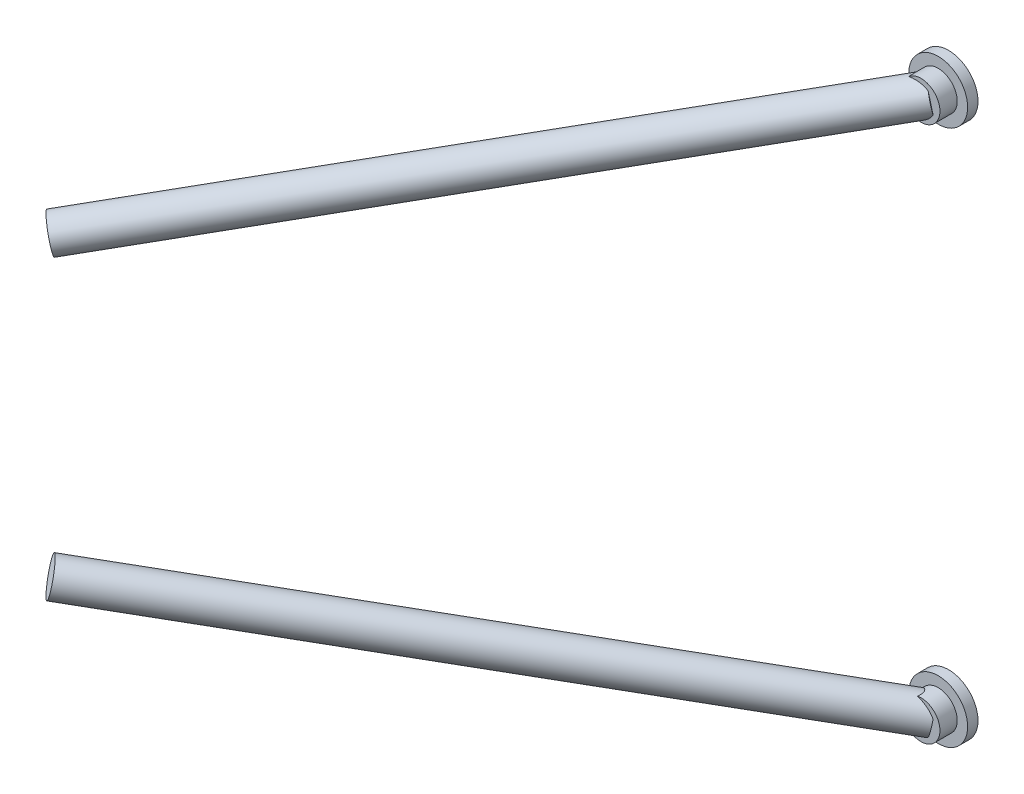
ISO-10303-21;
HEADER;
FILE_DESCRIPTION(('STEP AP214'),'2;1');
FILE_NAME('part.step','',(''),(''),'','','');
FILE_SCHEMA(('AUTOMOTIVE_DESIGN { 1 0 10303 214 1 1 1 1 }'));
ENDSEC;
DATA;
#1=APPLICATION_CONTEXT('core data for automotive mechanical design processes');
#2=APPLICATION_PROTOCOL_DEFINITION('international standard','automotive_design',2000,#1);
#3=PRODUCT_CONTEXT('',#1,'mechanical');
#4=PRODUCT('Part','Part','',(#3));
#5=PRODUCT_RELATED_PRODUCT_CATEGORY('part','',(#4));
#6=PRODUCT_DEFINITION_FORMATION('','',#4);
#7=PRODUCT_DEFINITION_CONTEXT('part definition',#1,'design');
#8=PRODUCT_DEFINITION('design','',#6,#7);
#9=PRODUCT_DEFINITION_SHAPE('','',#8);
#10=(LENGTH_UNIT() NAMED_UNIT(*) SI_UNIT(.MILLI.,.METRE.));
#11=(NAMED_UNIT(*) PLANE_ANGLE_UNIT() SI_UNIT($,.RADIAN.));
#12=(NAMED_UNIT(*) SI_UNIT($,.STERADIAN.) SOLID_ANGLE_UNIT());
#13=UNCERTAINTY_MEASURE_WITH_UNIT(LENGTH_MEASURE(1.E-05),#10,'distance_accuracy_value','');
#14=(GEOMETRIC_REPRESENTATION_CONTEXT(3) GLOBAL_UNCERTAINTY_ASSIGNED_CONTEXT((#13)) GLOBAL_UNIT_ASSIGNED_CONTEXT((#10,
#11,#12)) REPRESENTATION_CONTEXT('',''));
#15=CARTESIAN_POINT('',(0.,0.,0.));
#16=DIRECTION('',(0.,0.,1.));
#17=DIRECTION('',(1.,0.,0.));
#18=AXIS2_PLACEMENT_3D('',#15,#16,#17);
#19=CARTESIAN_POINT('',(380.,-155.,319.));
#20=DIRECTION('',(0.,0.,-1.));
#21=DIRECTION('',(-1.,0.,0.));
#22=AXIS2_PLACEMENT_3D('',#19,#20,#21);
#23=CYLINDRICAL_SURFACE('',#22,11.);
#24=CARTESIAN_POINT('',(380.,-155.,319.));
#25=DIRECTION('',(0.,0.,1.));
#26=DIRECTION('',(1.,0.,0.));
#27=AXIS2_PLACEMENT_3D('',#24,#25,#26);
#28=CIRCLE('',#27,11.);
#29=CARTESIAN_POINT('',(391.,-155.,319.));
#30=VERTEX_POINT('',#29);
#31=EDGE_CURVE('E11',#30,#30,#28,.T.);
#32=ORIENTED_EDGE('',*,*,#31,.F.);
#33=EDGE_LOOP('',(#32));
#34=FACE_BOUND('',#33,.T.);
#35=CARTESIAN_POINT('',(380.,-155.,309.));
#36=DIRECTION('',(0.,0.,1.));
#37=DIRECTION('',(1.,0.,0.));
#38=AXIS2_PLACEMENT_3D('',#35,#36,#37);
#39=CIRCLE('',#38,11.);
#40=CARTESIAN_POINT('',(391.,-155.,309.));
#41=VERTEX_POINT('',#40);
#42=EDGE_CURVE('E51',#41,#41,#39,.T.);
#43=ORIENTED_EDGE('',*,*,#42,.T.);
#44=EDGE_LOOP('',(#43));
#45=FACE_BOUND('',#44,.T.);
#46=ADVANCED_FACE('F48',(#34,#45),#23,.T.);
#47=CARTESIAN_POINT('',(380.,-155.,319.));
#48=DIRECTION('',(0.,0.,1.));
#49=DIRECTION('',(1.,0.,0.));
#50=AXIS2_PLACEMENT_3D('',#47,#48,#49);
#51=PLANE('',#50);
#52=ORIENTED_EDGE('',*,*,#31,.T.);
#53=EDGE_LOOP('',(#52));
#54=FACE_BOUND('',#53,.T.);
#55=ADVANCED_FACE('F61',(#54),#51,.T.);
#56=CARTESIAN_POINT('',(380.,-155.,309.));
#57=DIRECTION('',(0.,0.,1.));
#58=DIRECTION('',(1.,0.,0.));
#59=AXIS2_PLACEMENT_3D('',#56,#57,#58);
#60=PLANE('',#59);
#61=ORIENTED_EDGE('',*,*,#42,.F.);
#62=EDGE_LOOP('',(#61));
#63=FACE_BOUND('',#62,.T.);
#64=ADVANCED_FACE('F63',(#63),#60,.F.);
#65=CLOSED_SHELL('',(#46,#55,#64));
#66=MANIFOLD_SOLID_BREP('B2',#65);
#67=CARTESIAN_POINT('',(380.,-155.,309.));
#68=DIRECTION('',(0.,0.,-1.));
#69=DIRECTION('',(-1.,0.,0.));
#70=AXIS2_PLACEMENT_3D('',#67,#68,#69);
#71=CYLINDRICAL_SURFACE('',#70,17.);
#72=CARTESIAN_POINT('',(380.,-155.,309.));
#73=DIRECTION('',(0.,0.,1.));
#74=DIRECTION('',(1.,0.,0.));
#75=AXIS2_PLACEMENT_3D('',#72,#73,#74);
#76=CIRCLE('',#75,17.);
#77=CARTESIAN_POINT('',(397.,-155.,309.));
#78=VERTEX_POINT('',#77);
#79=EDGE_CURVE('E50',#78,#78,#76,.T.);
#80=ORIENTED_EDGE('',*,*,#79,.F.);
#81=EDGE_LOOP('',(#80));
#82=FACE_BOUND('',#81,.T.);
#83=CARTESIAN_POINT('',(380.,-155.,303.));
#84=DIRECTION('',(0.,0.,1.));
#85=DIRECTION('',(1.,0.,0.));
#86=AXIS2_PLACEMENT_3D('',#83,#84,#85);
#87=CIRCLE('',#86,17.);
#88=CARTESIAN_POINT('',(397.,-155.,303.));
#89=VERTEX_POINT('',#88);
#90=EDGE_CURVE('E99',#89,#89,#87,.T.);
#91=ORIENTED_EDGE('',*,*,#90,.T.);
#92=EDGE_LOOP('',(#91));
#93=FACE_BOUND('',#92,.T.);
#94=ADVANCED_FACE('F100',(#82,#93),#71,.T.);
#95=CARTESIAN_POINT('',(380.,-155.,309.));
#96=DIRECTION('',(0.,0.,1.));
#97=DIRECTION('',(1.,0.,0.));
#98=AXIS2_PLACEMENT_3D('',#95,#96,#97);
#99=PLANE('',#98);
#100=ORIENTED_EDGE('',*,*,#79,.T.);
#101=EDGE_LOOP('',(#100));
#102=FACE_BOUND('',#101,.T.);
#103=ADVANCED_FACE('F115',(#102),#99,.T.);
#104=CARTESIAN_POINT('',(380.,-155.,303.));
#105=DIRECTION('',(0.,0.,1.));
#106=DIRECTION('',(1.,0.,0.));
#107=AXIS2_PLACEMENT_3D('',#104,#105,#106);
#108=PLANE('',#107);
#109=ORIENTED_EDGE('',*,*,#90,.F.);
#110=EDGE_LOOP('',(#109));
#111=FACE_BOUND('',#110,.T.);
#112=ADVANCED_FACE('F109',(#111),#108,.F.);
#113=CLOSED_SHELL('',(#94,#103,#112));
#114=MANIFOLD_SOLID_BREP('B6',#113);
#115=CARTESIAN_POINT('',(380.,-155.,313.));
#116=DIRECTION('',(-0.693094538296577,0.188281587175054,0.695823256951288));
#117=DIRECTION('',(0.579279317023966,-0.429016822341156,0.693094538296577));
#118=AXIS2_PLACEMENT_3D('',#115,#116,#117);
#119=CYLINDRICAL_SURFACE('',#118,10.);
#120=CARTESIAN_POINT('',(380.,-155.,313.));
#121=DIRECTION('',(0.693094538296577,-0.188281587175054,-0.695823256951288));
#122=DIRECTION('',(-0.579279317023966,0.429016822341156,-0.693094538296577));
#123=AXIS2_PLACEMENT_3D('',#120,#121,#122);
#124=CIRCLE('',#123,10.);
#125=CARTESIAN_POINT('',(374.20720682976,-150.709831776588,306.069054617034));
#126=VERTEX_POINT('',#125);
#127=EDGE_CURVE('E96',#126,#126,#124,.T.);
#128=ORIENTED_EDGE('',*,*,#127,.F.);
#129=EDGE_LOOP('',(#128));
#130=FACE_BOUND('',#129,.T.);
#131=CARTESIAN_POINT('',(126.,-86.,568.));
#132=DIRECTION('',(0.693094538296577,-0.188281587175054,-0.695823256951288));
#133=DIRECTION('',(-0.579279317023966,0.429016822341156,-0.693094538296577));
#134=AXIS2_PLACEMENT_3D('',#131,#132,#133);
#135=CIRCLE('',#134,10.);
#136=CARTESIAN_POINT('',(120.20720682976,-81.7098317765884,561.069054617034));
#137=VERTEX_POINT('',#136);
#138=EDGE_CURVE('E149',#137,#137,#135,.T.);
#139=ORIENTED_EDGE('',*,*,#138,.T.);
#140=EDGE_LOOP('',(#139));
#141=FACE_BOUND('',#140,.T.);
#142=ADVANCED_FACE('F148',(#130,#141),#119,.T.);
#143=CARTESIAN_POINT('',(380.,-155.,313.));
#144=DIRECTION('',(0.693094538296577,-0.188281587175054,-0.695823256951288));
#145=DIRECTION('',(-0.579279317023966,0.429016822341156,-0.693094538296577));
#146=AXIS2_PLACEMENT_3D('',#143,#144,#145);
#147=PLANE('',#146);
#148=ORIENTED_EDGE('',*,*,#127,.T.);
#149=EDGE_LOOP('',(#148));
#150=FACE_BOUND('',#149,.T.);
#151=ADVANCED_FACE('F161',(#150),#147,.T.);
#152=CARTESIAN_POINT('',(126.,-86.,568.));
#153=DIRECTION('',(0.693094538296577,-0.188281587175054,-0.695823256951288));
#154=DIRECTION('',(-0.579279317023966,0.429016822341156,-0.693094538296577));
#155=AXIS2_PLACEMENT_3D('',#152,#153,#154);
#156=PLANE('',#155);
#157=ORIENTED_EDGE('',*,*,#138,.F.);
#158=EDGE_LOOP('',(#157));
#159=FACE_BOUND('',#158,.T.);
#160=ADVANCED_FACE('F157',(#159),#156,.F.);
#161=CLOSED_SHELL('',(#142,#151,#160));
#162=MANIFOLD_SOLID_BREP('B45',#161);
#163=CARTESIAN_POINT('',(380.,155.,319.));
#164=DIRECTION('',(0.,0.,-1.));
#165=DIRECTION('',(-1.,0.,0.));
#166=AXIS2_PLACEMENT_3D('',#163,#164,#165);
#167=CYLINDRICAL_SURFACE('',#166,11.);
#168=CARTESIAN_POINT('',(380.,155.,319.));
#169=DIRECTION('',(0.,0.,1.));
#170=DIRECTION('',(1.,0.,0.));
#171=AXIS2_PLACEMENT_3D('',#168,#169,#170);
#172=CIRCLE('',#171,11.);
#173=CARTESIAN_POINT('',(391.,155.,319.));
#174=VERTEX_POINT('',#173);
#175=EDGE_CURVE('E144',#174,#174,#172,.T.);
#176=ORIENTED_EDGE('',*,*,#175,.F.);
#177=EDGE_LOOP('',(#176));
#178=FACE_BOUND('',#177,.T.);
#179=CARTESIAN_POINT('',(380.,155.,309.));
#180=DIRECTION('',(0.,0.,1.));
#181=DIRECTION('',(1.,0.,0.));
#182=AXIS2_PLACEMENT_3D('',#179,#180,#181);
#183=CIRCLE('',#182,11.);
#184=CARTESIAN_POINT('',(391.,155.,309.));
#185=VERTEX_POINT('',#184);
#186=EDGE_CURVE('E196',#185,#185,#183,.T.);
#187=ORIENTED_EDGE('',*,*,#186,.T.);
#188=EDGE_LOOP('',(#187));
#189=FACE_BOUND('',#188,.T.);
#190=ADVANCED_FACE('F191',(#178,#189),#167,.T.);
#191=CARTESIAN_POINT('',(380.,155.,319.));
#192=DIRECTION('',(0.,0.,1.));
#193=DIRECTION('',(1.,0.,0.));
#194=AXIS2_PLACEMENT_3D('',#191,#192,#193);
#195=PLANE('',#194);
#196=ORIENTED_EDGE('',*,*,#175,.T.);
#197=EDGE_LOOP('',(#196));
#198=FACE_BOUND('',#197,.T.);
#199=ADVANCED_FACE('F209',(#198),#195,.T.);
#200=CARTESIAN_POINT('',(380.,155.,309.));
#201=DIRECTION('',(0.,0.,1.));
#202=DIRECTION('',(1.,0.,0.));
#203=AXIS2_PLACEMENT_3D('',#200,#201,#202);
#204=PLANE('',#203);
#205=ORIENTED_EDGE('',*,*,#186,.F.);
#206=EDGE_LOOP('',(#205));
#207=FACE_BOUND('',#206,.T.);
#208=ADVANCED_FACE('F208',(#207),#204,.F.);
#209=CLOSED_SHELL('',(#190,#199,#208));
#210=MANIFOLD_SOLID_BREP('B93',#209);
#211=CARTESIAN_POINT('',(380.,155.,309.));
#212=DIRECTION('',(0.,0.,-1.));
#213=DIRECTION('',(-1.,0.,0.));
#214=AXIS2_PLACEMENT_3D('',#211,#212,#213);
#215=CYLINDRICAL_SURFACE('',#214,17.);
#216=CARTESIAN_POINT('',(380.,155.,309.));
#217=DIRECTION('',(0.,0.,1.));
#218=DIRECTION('',(1.,0.,0.));
#219=AXIS2_PLACEMENT_3D('',#216,#217,#218);
#220=CIRCLE('',#219,17.);
#221=CARTESIAN_POINT('',(397.,155.,309.));
#222=VERTEX_POINT('',#221);
#223=EDGE_CURVE('E194',#222,#222,#220,.T.);
#224=ORIENTED_EDGE('',*,*,#223,.F.);
#225=EDGE_LOOP('',(#224));
#226=FACE_BOUND('',#225,.T.);
#227=CARTESIAN_POINT('',(380.,155.,303.));
#228=DIRECTION('',(0.,0.,1.));
#229=DIRECTION('',(1.,0.,0.));
#230=AXIS2_PLACEMENT_3D('',#227,#228,#229);
#231=CIRCLE('',#230,17.);
#232=CARTESIAN_POINT('',(397.,155.,303.));
#233=VERTEX_POINT('',#232);
#234=EDGE_CURVE('E247',#233,#233,#231,.T.);
#235=ORIENTED_EDGE('',*,*,#234,.T.);
#236=EDGE_LOOP('',(#235));
#237=FACE_BOUND('',#236,.T.);
#238=ADVANCED_FACE('F241',(#226,#237),#215,.T.);
#239=CARTESIAN_POINT('',(380.,155.,309.));
#240=DIRECTION('',(0.,0.,1.));
#241=DIRECTION('',(1.,0.,0.));
#242=AXIS2_PLACEMENT_3D('',#239,#240,#241);
#243=PLANE('',#242);
#244=ORIENTED_EDGE('',*,*,#223,.T.);
#245=EDGE_LOOP('',(#244));
#246=FACE_BOUND('',#245,.T.);
#247=ADVANCED_FACE('F256',(#246),#243,.T.);
#248=CARTESIAN_POINT('',(380.,155.,303.));
#249=DIRECTION('',(0.,0.,1.));
#250=DIRECTION('',(1.,0.,0.));
#251=AXIS2_PLACEMENT_3D('',#248,#249,#250);
#252=PLANE('',#251);
#253=ORIENTED_EDGE('',*,*,#234,.F.);
#254=EDGE_LOOP('',(#253));
#255=FACE_BOUND('',#254,.T.);
#256=ADVANCED_FACE('F258',(#255),#252,.F.);
#257=CLOSED_SHELL('',(#238,#247,#256));
#258=MANIFOLD_SOLID_BREP('B136',#257);
#259=CARTESIAN_POINT('',(380.,155.,313.));
#260=DIRECTION('',(-0.693094538296577,-0.188281587175054,0.695823256951288));
#261=DIRECTION('',(0.579279317023966,0.429016822341156,0.693094538296577));
#262=AXIS2_PLACEMENT_3D('',#259,#260,#261);
#263=CYLINDRICAL_SURFACE('',#262,10.);
#264=CARTESIAN_POINT('',(380.,155.,313.));
#265=DIRECTION('',(0.693094538296577,0.188281587175054,-0.695823256951288));
#266=DIRECTION('',(-0.579279317023966,-0.429016822341156,-0.693094538296577));
#267=AXIS2_PLACEMENT_3D('',#264,#265,#266);
#268=CIRCLE('',#267,10.);
#269=CARTESIAN_POINT('',(374.20720682976,150.709831776588,306.069054617034));
#270=VERTEX_POINT('',#269);
#271=EDGE_CURVE('E245',#270,#270,#268,.T.);
#272=ORIENTED_EDGE('',*,*,#271,.F.);
#273=EDGE_LOOP('',(#272));
#274=FACE_BOUND('',#273,.T.);
#275=CARTESIAN_POINT('',(126.,86.,568.));
#276=DIRECTION('',(0.693094538296577,0.188281587175054,-0.695823256951288));
#277=DIRECTION('',(-0.579279317023966,-0.429016822341156,-0.693094538296577));
#278=AXIS2_PLACEMENT_3D('',#275,#276,#277);
#279=CIRCLE('',#278,10.);
#280=CARTESIAN_POINT('',(120.20720682976,81.7098317765884,561.069054617034));
#281=VERTEX_POINT('',#280);
#282=EDGE_CURVE('E290',#281,#281,#279,.T.);
#283=ORIENTED_EDGE('',*,*,#282,.T.);
#284=EDGE_LOOP('',(#283));
#285=FACE_BOUND('',#284,.T.);
#286=ADVANCED_FACE('F282',(#274,#285),#263,.T.);
#287=CARTESIAN_POINT('',(380.,155.,313.));
#288=DIRECTION('',(0.693094538296577,0.188281587175054,-0.695823256951288));
#289=DIRECTION('',(-0.579279317023966,-0.429016822341156,-0.693094538296577));
#290=AXIS2_PLACEMENT_3D('',#287,#288,#289);
#291=PLANE('',#290);
#292=ORIENTED_EDGE('',*,*,#271,.T.);
#293=EDGE_LOOP('',(#292));
#294=FACE_BOUND('',#293,.T.);
#295=ADVANCED_FACE('F297',(#294),#291,.T.);
#296=CARTESIAN_POINT('',(126.,86.,568.));
#297=DIRECTION('',(0.693094538296577,0.188281587175054,-0.695823256951288));
#298=DIRECTION('',(-0.579279317023966,-0.429016822341156,-0.693094538296577));
#299=AXIS2_PLACEMENT_3D('',#296,#297,#298);
#300=PLANE('',#299);
#301=ORIENTED_EDGE('',*,*,#282,.F.);
#302=EDGE_LOOP('',(#301));
#303=FACE_BOUND('',#302,.T.);
#304=ADVANCED_FACE('F300',(#303),#300,.F.);
#305=CLOSED_SHELL('',(#286,#295,#304));
#306=MANIFOLD_SOLID_BREP('B187',#305);
#307=ADVANCED_BREP_SHAPE_REPRESENTATION('',(#18,#66,#114,#162,#210,#258,#306),#14);
#308=SHAPE_DEFINITION_REPRESENTATION(#9,#307);
ENDSEC;
END-ISO-10303-21;
